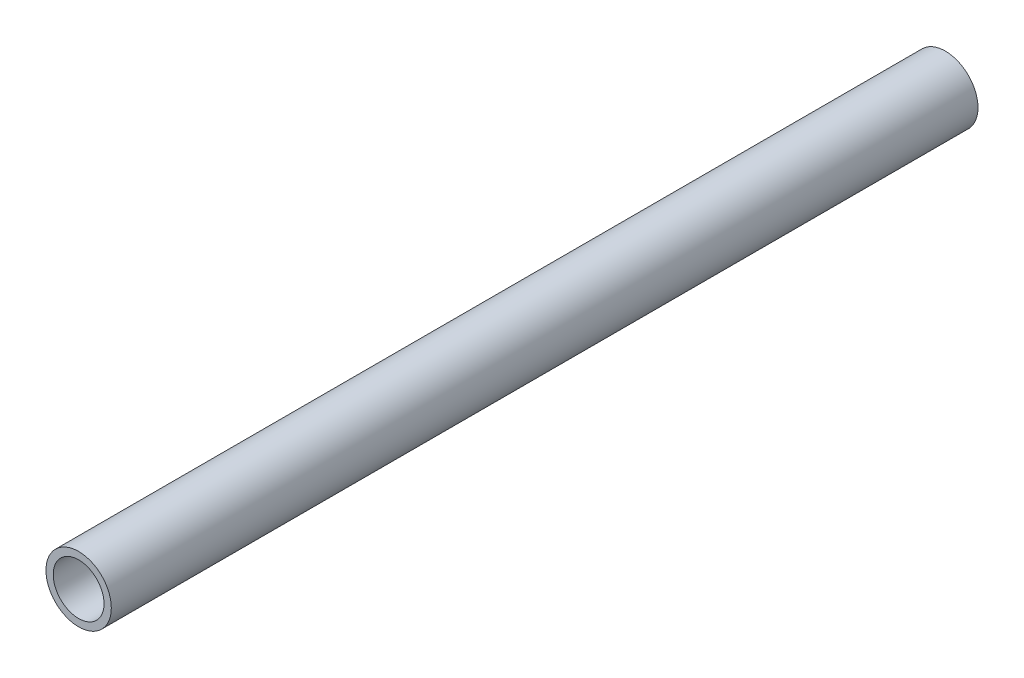
ISO-10303-21;
HEADER;
FILE_DESCRIPTION(('STEP AP214'),'2;1');
FILE_NAME('part.step','',(''),(''),'','','');
FILE_SCHEMA(('AUTOMOTIVE_DESIGN { 1 0 10303 214 1 1 1 1 }'));
ENDSEC;
DATA;
#1=APPLICATION_CONTEXT('core data for automotive mechanical design processes');
#2=APPLICATION_PROTOCOL_DEFINITION('international standard','automotive_design',2000,#1);
#3=PRODUCT_CONTEXT('',#1,'mechanical');
#4=PRODUCT('Part','Part','',(#3));
#5=PRODUCT_RELATED_PRODUCT_CATEGORY('part','',(#4));
#6=PRODUCT_DEFINITION_FORMATION('','',#4);
#7=PRODUCT_DEFINITION_CONTEXT('part definition',#1,'design');
#8=PRODUCT_DEFINITION('design','',#6,#7);
#9=PRODUCT_DEFINITION_SHAPE('','',#8);
#10=(LENGTH_UNIT() NAMED_UNIT(*) SI_UNIT(.MILLI.,.METRE.));
#11=(NAMED_UNIT(*) PLANE_ANGLE_UNIT() SI_UNIT($,.RADIAN.));
#12=(NAMED_UNIT(*) SI_UNIT($,.STERADIAN.) SOLID_ANGLE_UNIT());
#13=UNCERTAINTY_MEASURE_WITH_UNIT(LENGTH_MEASURE(1.E-05),#10,'distance_accuracy_value','');
#14=(GEOMETRIC_REPRESENTATION_CONTEXT(3) GLOBAL_UNCERTAINTY_ASSIGNED_CONTEXT((#13)) GLOBAL_UNIT_ASSIGNED_CONTEXT((#10,
#11,#12)) REPRESENTATION_CONTEXT('',''));
#15=CARTESIAN_POINT('',(0.,0.,0.));
#16=DIRECTION('',(0.,0.,1.));
#17=DIRECTION('',(1.,0.,0.));
#18=AXIS2_PLACEMENT_3D('',#15,#16,#17);
#19=CARTESIAN_POINT('',(0.,0.,238.63));
#20=DIRECTION('',(0.,0.,1.));
#21=DIRECTION('',(1.,0.,0.));
#22=AXIS2_PLACEMENT_3D('',#19,#20,#21);
#23=PLANE('',#22);
#24=CARTESIAN_POINT('',(0.,0.,238.63));
#25=DIRECTION('',(0.,0.,1.));
#26=DIRECTION('',(1.,0.,0.));
#27=AXIS2_PLACEMENT_3D('',#24,#25,#26);
#28=CIRCLE('',#27,9.);
#29=CARTESIAN_POINT('',(9.,0.,238.63));
#30=VERTEX_POINT('',#29);
#31=EDGE_CURVE('E10',#30,#30,#28,.T.);
#32=ORIENTED_EDGE('',*,*,#31,.T.);
#33=EDGE_LOOP('',(#32));
#34=FACE_BOUND('',#33,.T.);
#35=CARTESIAN_POINT('',(0.,0.,238.63));
#36=DIRECTION('',(0.,0.,1.));
#37=DIRECTION('',(1.,0.,0.));
#38=AXIS2_PLACEMENT_3D('',#35,#36,#37);
#39=CIRCLE('',#38,7.);
#40=CARTESIAN_POINT('',(7.,0.,238.63));
#41=VERTEX_POINT('',#40);
#42=EDGE_CURVE('E44',#41,#41,#39,.T.);
#43=ORIENTED_EDGE('',*,*,#42,.F.);
#44=EDGE_LOOP('',(#43));
#45=FACE_BOUND('',#44,.T.);
#46=ADVANCED_FACE('F33',(#34,#45),#23,.T.);
#47=CARTESIAN_POINT('',(0.,0.,0.));
#48=DIRECTION('',(0.,0.,1.));
#49=DIRECTION('',(1.,0.,0.));
#50=AXIS2_PLACEMENT_3D('',#47,#48,#49);
#51=PLANE('',#50);
#52=CARTESIAN_POINT('',(0.,0.,0.));
#53=DIRECTION('',(0.,0.,1.));
#54=DIRECTION('',(1.,0.,0.));
#55=AXIS2_PLACEMENT_3D('',#52,#53,#54);
#56=CIRCLE('',#55,9.);
#57=CARTESIAN_POINT('',(9.,0.,0.));
#58=VERTEX_POINT('',#57);
#59=EDGE_CURVE('E37',#58,#58,#56,.T.);
#60=ORIENTED_EDGE('',*,*,#59,.F.);
#61=EDGE_LOOP('',(#60));
#62=FACE_BOUND('',#61,.T.);
#63=CARTESIAN_POINT('',(0.,0.,0.));
#64=DIRECTION('',(0.,0.,1.));
#65=DIRECTION('',(1.,0.,0.));
#66=AXIS2_PLACEMENT_3D('',#63,#64,#65);
#67=CIRCLE('',#66,7.);
#68=CARTESIAN_POINT('',(7.,0.,0.));
#69=VERTEX_POINT('',#68);
#70=EDGE_CURVE('E46',#69,#69,#67,.T.);
#71=ORIENTED_EDGE('',*,*,#70,.T.);
#72=EDGE_LOOP('',(#71));
#73=FACE_BOUND('',#72,.T.);
#74=ADVANCED_FACE('F56',(#62,#73),#51,.F.);
#75=CARTESIAN_POINT('',(0.,0.,238.63));
#76=DIRECTION('',(0.,0.,-1.));
#77=DIRECTION('',(-1.,0.,0.));
#78=AXIS2_PLACEMENT_3D('',#75,#76,#77);
#79=CYLINDRICAL_SURFACE('',#78,9.);
#80=ORIENTED_EDGE('',*,*,#31,.F.);
#81=EDGE_LOOP('',(#80));
#82=FACE_BOUND('',#81,.T.);
#83=ORIENTED_EDGE('',*,*,#59,.T.);
#84=EDGE_LOOP('',(#83));
#85=FACE_BOUND('',#84,.T.);
#86=ADVANCED_FACE('F35',(#82,#85),#79,.T.);
#87=CARTESIAN_POINT('',(0.,0.,238.63));
#88=DIRECTION('',(0.,0.,-1.));
#89=DIRECTION('',(-1.,0.,0.));
#90=AXIS2_PLACEMENT_3D('',#87,#88,#89);
#91=CYLINDRICAL_SURFACE('',#90,7.);
#92=ORIENTED_EDGE('',*,*,#42,.T.);
#93=EDGE_LOOP('',(#92));
#94=FACE_BOUND('',#93,.T.);
#95=ORIENTED_EDGE('',*,*,#70,.F.);
#96=EDGE_LOOP('',(#95));
#97=FACE_BOUND('',#96,.T.);
#98=ADVANCED_FACE('F52',(#94,#97),#91,.F.);
#99=CLOSED_SHELL('',(#46,#74,#86,#98));
#100=MANIFOLD_SOLID_BREP('B2',#99);
#101=ADVANCED_BREP_SHAPE_REPRESENTATION('',(#18,#100),#14);
#102=SHAPE_DEFINITION_REPRESENTATION(#9,#101);
ENDSEC;
END-ISO-10303-21;
